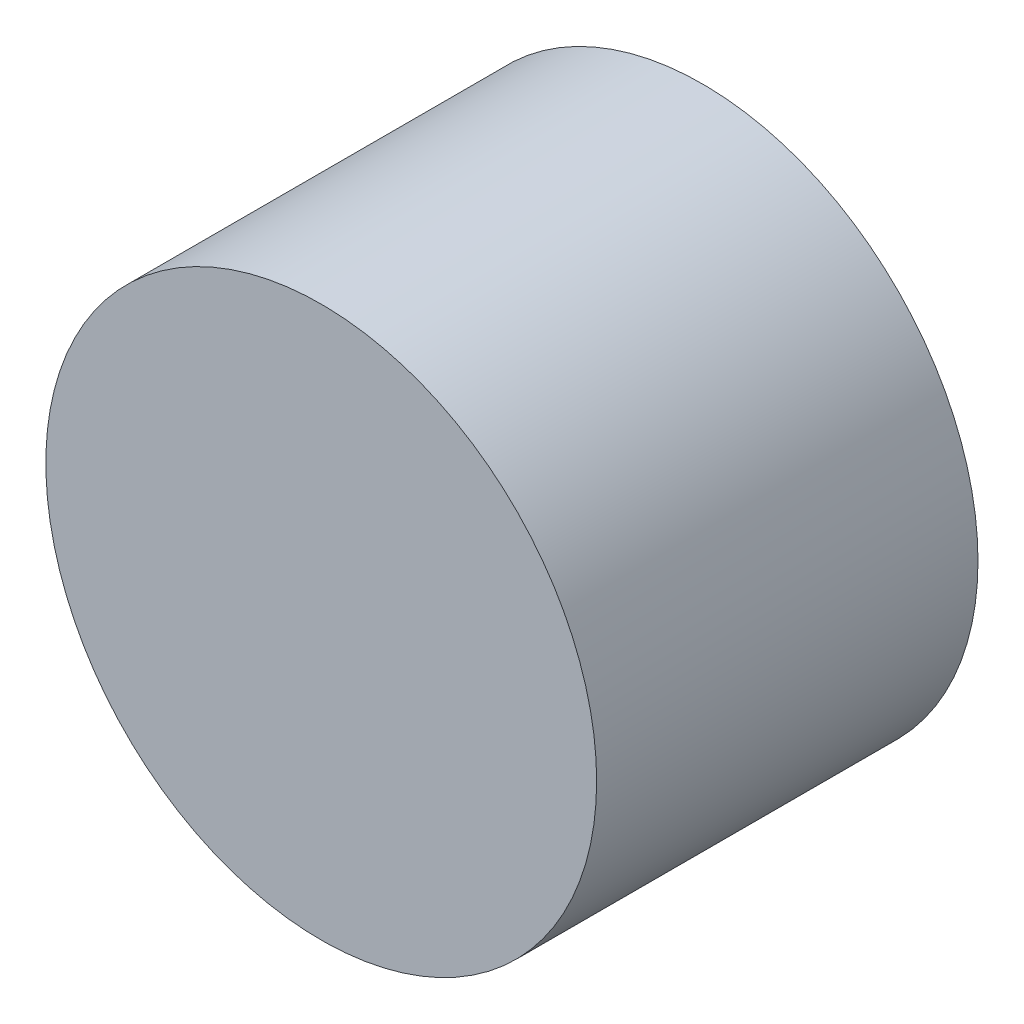
ISO-10303-21;
HEADER;
FILE_DESCRIPTION(('STEP AP214'),'2;1');
FILE_NAME('part.step','',(''),(''),'','','');
FILE_SCHEMA(('AUTOMOTIVE_DESIGN { 1 0 10303 214 1 1 1 1 }'));
ENDSEC;
DATA;
#1=APPLICATION_CONTEXT('core data for automotive mechanical design processes');
#2=APPLICATION_PROTOCOL_DEFINITION('international standard','automotive_design',2000,#1);
#3=PRODUCT_CONTEXT('',#1,'mechanical');
#4=PRODUCT('Part','Part','',(#3));
#5=PRODUCT_RELATED_PRODUCT_CATEGORY('part','',(#4));
#6=PRODUCT_DEFINITION_FORMATION('','',#4);
#7=PRODUCT_DEFINITION_CONTEXT('part definition',#1,'design');
#8=PRODUCT_DEFINITION('design','',#6,#7);
#9=PRODUCT_DEFINITION_SHAPE('','',#8);
#10=(LENGTH_UNIT() NAMED_UNIT(*) SI_UNIT(.MILLI.,.METRE.));
#11=(NAMED_UNIT(*) PLANE_ANGLE_UNIT() SI_UNIT($,.RADIAN.));
#12=(NAMED_UNIT(*) SI_UNIT($,.STERADIAN.) SOLID_ANGLE_UNIT());
#13=UNCERTAINTY_MEASURE_WITH_UNIT(LENGTH_MEASURE(1.E-05),#10,'distance_accuracy_value','');
#14=(GEOMETRIC_REPRESENTATION_CONTEXT(3) GLOBAL_UNCERTAINTY_ASSIGNED_CONTEXT((#13)) GLOBAL_UNIT_ASSIGNED_CONTEXT((#10,
#11,#12)) REPRESENTATION_CONTEXT('',''));
#15=CARTESIAN_POINT('',(0.,0.,0.));
#16=DIRECTION('',(0.,0.,1.));
#17=DIRECTION('',(1.,0.,0.));
#18=AXIS2_PLACEMENT_3D('',#15,#16,#17);
#19=CARTESIAN_POINT('',(0.,0.,9.));
#20=DIRECTION('',(0.,0.,-1.));
#21=DIRECTION('',(-1.,0.,0.));
#22=AXIS2_PLACEMENT_3D('',#19,#20,#21);
#23=CYLINDRICAL_SURFACE('',#22,6.5);
#24=CARTESIAN_POINT('',(0.,0.,9.));
#25=DIRECTION('',(0.,0.,1.));
#26=DIRECTION('',(1.,0.,0.));
#27=AXIS2_PLACEMENT_3D('',#24,#25,#26);
#28=CIRCLE('',#27,6.5);
#29=CARTESIAN_POINT('',(6.5,0.,9.));
#30=VERTEX_POINT('',#29);
#31=EDGE_CURVE('E10',#30,#30,#28,.T.);
#32=ORIENTED_EDGE('',*,*,#31,.F.);
#33=EDGE_LOOP('',(#32));
#34=FACE_BOUND('',#33,.T.);
#35=CARTESIAN_POINT('',(0.,0.,0.));
#36=DIRECTION('',(0.,0.,1.));
#37=DIRECTION('',(1.,0.,0.));
#38=AXIS2_PLACEMENT_3D('',#35,#36,#37);
#39=CIRCLE('',#38,6.5);
#40=CARTESIAN_POINT('',(6.5,0.,0.));
#41=VERTEX_POINT('',#40);
#42=EDGE_CURVE('E34',#41,#41,#39,.T.);
#43=ORIENTED_EDGE('',*,*,#42,.T.);
#44=EDGE_LOOP('',(#43));
#45=FACE_BOUND('',#44,.T.);
#46=ADVANCED_FACE('F31',(#34,#45),#23,.T.);
#47=CARTESIAN_POINT('',(0.,0.,9.));
#48=DIRECTION('',(0.,0.,1.));
#49=DIRECTION('',(1.,0.,0.));
#50=AXIS2_PLACEMENT_3D('',#47,#48,#49);
#51=PLANE('',#50);
#52=ORIENTED_EDGE('',*,*,#31,.T.);
#53=EDGE_LOOP('',(#52));
#54=FACE_BOUND('',#53,.T.);
#55=ADVANCED_FACE('F46',(#54),#51,.T.);
#56=CARTESIAN_POINT('',(0.,0.,0.));
#57=DIRECTION('',(0.,0.,1.));
#58=DIRECTION('',(1.,0.,0.));
#59=AXIS2_PLACEMENT_3D('',#56,#57,#58);
#60=PLANE('',#59);
#61=ORIENTED_EDGE('',*,*,#42,.F.);
#62=EDGE_LOOP('',(#61));
#63=FACE_BOUND('',#62,.T.);
#64=ADVANCED_FACE('F44',(#63),#60,.F.);
#65=CLOSED_SHELL('',(#46,#55,#64));
#66=MANIFOLD_SOLID_BREP('B2',#65);
#67=ADVANCED_BREP_SHAPE_REPRESENTATION('',(#18,#66),#14);
#68=SHAPE_DEFINITION_REPRESENTATION(#9,#67);
ENDSEC;
END-ISO-10303-21;
